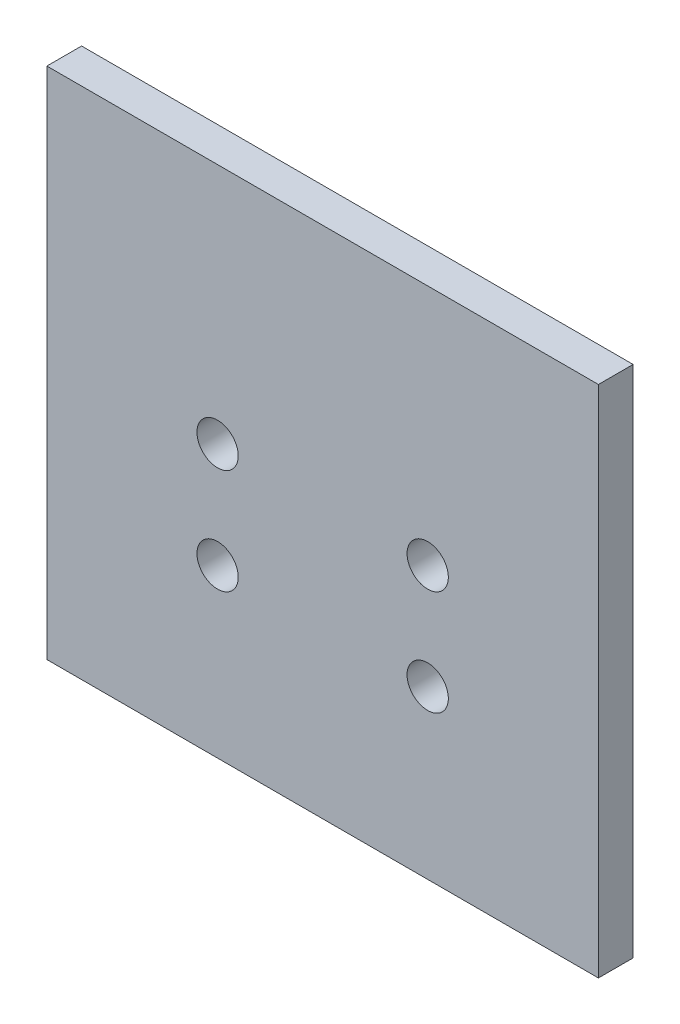
ISO-10303-21;
HEADER;
FILE_DESCRIPTION(('STEP AP214'),'2;1');
FILE_NAME('part.step','',(''),(''),'','','');
FILE_SCHEMA(('AUTOMOTIVE_DESIGN { 1 0 10303 214 1 1 1 1 }'));
ENDSEC;
DATA;
#1=APPLICATION_CONTEXT('core data for automotive mechanical design processes');
#2=APPLICATION_PROTOCOL_DEFINITION('international standard','automotive_design',2000,#1);
#3=PRODUCT_CONTEXT('',#1,'mechanical');
#4=PRODUCT('Part','Part','',(#3));
#5=PRODUCT_RELATED_PRODUCT_CATEGORY('part','',(#4));
#6=PRODUCT_DEFINITION_FORMATION('','',#4);
#7=PRODUCT_DEFINITION_CONTEXT('part definition',#1,'design');
#8=PRODUCT_DEFINITION('design','',#6,#7);
#9=PRODUCT_DEFINITION_SHAPE('','',#8);
#10=(LENGTH_UNIT() NAMED_UNIT(*) SI_UNIT(.MILLI.,.METRE.));
#11=(NAMED_UNIT(*) PLANE_ANGLE_UNIT() SI_UNIT($,.RADIAN.));
#12=(NAMED_UNIT(*) SI_UNIT($,.STERADIAN.) SOLID_ANGLE_UNIT());
#13=UNCERTAINTY_MEASURE_WITH_UNIT(LENGTH_MEASURE(1.E-05),#10,'distance_accuracy_value','');
#14=(GEOMETRIC_REPRESENTATION_CONTEXT(3) GLOBAL_UNCERTAINTY_ASSIGNED_CONTEXT((#13)) GLOBAL_UNIT_ASSIGNED_CONTEXT((#10,
#11,#12)) REPRESENTATION_CONTEXT('',''));
#15=CARTESIAN_POINT('',(0.,0.,0.));
#16=DIRECTION('',(0.,0.,1.));
#17=DIRECTION('',(1.,0.,0.));
#18=AXIS2_PLACEMENT_3D('',#15,#16,#17);
#19=CARTESIAN_POINT('',(73.5,68.5,0.));
#20=DIRECTION('',(0.,1.,0.));
#21=DIRECTION('',(0.,0.,1.));
#22=AXIS2_PLACEMENT_3D('',#19,#20,#21);
#23=PLANE('',#22);
#24=DIRECTION('',(-1.,0.,0.));
#25=VECTOR('',#24,1.);
#26=CARTESIAN_POINT('',(73.5,68.5,9.25));
#27=LINE('',#26,#25);
#28=CARTESIAN_POINT('',(73.5,68.5,9.25));
#29=VERTEX_POINT('',#28);
#30=CARTESIAN_POINT('',(-73.5,68.5,9.25));
#31=VERTEX_POINT('',#30);
#32=EDGE_CURVE('E104',#29,#31,#27,.T.);
#33=ORIENTED_EDGE('',*,*,#32,.F.);
#34=DIRECTION('',(0.,0.,1.));
#35=VECTOR('',#34,1.);
#36=CARTESIAN_POINT('',(73.5,68.5,0.));
#37=LINE('',#36,#35);
#38=CARTESIAN_POINT('',(73.5,68.5,0.));
#39=VERTEX_POINT('',#38);
#40=EDGE_CURVE('E11',#39,#29,#37,.T.);
#41=ORIENTED_EDGE('',*,*,#40,.F.);
#42=DIRECTION('',(-1.,0.,0.));
#43=VECTOR('',#42,1.);
#44=CARTESIAN_POINT('',(73.5,68.5,0.));
#45=LINE('',#44,#43);
#46=CARTESIAN_POINT('',(-73.5,68.5,0.));
#47=VERTEX_POINT('',#46);
#48=EDGE_CURVE('E97',#39,#47,#45,.T.);
#49=ORIENTED_EDGE('',*,*,#48,.T.);
#50=DIRECTION('',(0.,0.,1.));
#51=VECTOR('',#50,1.);
#52=CARTESIAN_POINT('',(-73.5,68.5,0.));
#53=LINE('',#52,#51);
#54=EDGE_CURVE('E42',#47,#31,#53,.T.);
#55=ORIENTED_EDGE('',*,*,#54,.T.);
#56=EDGE_LOOP('',(#33,#41,#49,#55));
#57=FACE_BOUND('',#56,.T.);
#58=ADVANCED_FACE('F39',(#57),#23,.T.);
#59=CARTESIAN_POINT('',(73.5,-68.5,0.));
#60=DIRECTION('',(1.,0.,0.));
#61=DIRECTION('',(0.,0.,-1.));
#62=AXIS2_PLACEMENT_3D('',#59,#60,#61);
#63=PLANE('',#62);
#64=DIRECTION('',(0.,1.,0.));
#65=VECTOR('',#64,1.);
#66=CARTESIAN_POINT('',(73.5,-68.5,9.25));
#67=LINE('',#66,#65);
#68=CARTESIAN_POINT('',(73.5,-68.5,9.25));
#69=VERTEX_POINT('',#68);
#70=EDGE_CURVE('E99',#69,#29,#67,.T.);
#71=ORIENTED_EDGE('',*,*,#70,.F.);
#72=DIRECTION('',(0.,0.,1.));
#73=VECTOR('',#72,1.);
#74=CARTESIAN_POINT('',(73.5,-68.5,0.));
#75=LINE('',#74,#73);
#76=CARTESIAN_POINT('',(73.5,-68.5,0.));
#77=VERTEX_POINT('',#76);
#78=EDGE_CURVE('E48',#77,#69,#75,.T.);
#79=ORIENTED_EDGE('',*,*,#78,.F.);
#80=DIRECTION('',(0.,1.,0.));
#81=VECTOR('',#80,1.);
#82=CARTESIAN_POINT('',(73.5,-68.5,0.));
#83=LINE('',#82,#81);
#84=EDGE_CURVE('E94',#77,#39,#83,.T.);
#85=ORIENTED_EDGE('',*,*,#84,.T.);
#86=ORIENTED_EDGE('',*,*,#40,.T.);
#87=EDGE_LOOP('',(#71,#79,#85,#86));
#88=FACE_BOUND('',#87,.T.);
#89=ADVANCED_FACE('F115',(#88),#63,.T.);
#90=CARTESIAN_POINT('',(-73.5,-68.5,0.));
#91=DIRECTION('',(0.,-1.,0.));
#92=DIRECTION('',(0.,0.,-1.));
#93=AXIS2_PLACEMENT_3D('',#90,#91,#92);
#94=PLANE('',#93);
#95=DIRECTION('',(1.,0.,0.));
#96=VECTOR('',#95,1.);
#97=CARTESIAN_POINT('',(-73.5,-68.5,9.25));
#98=LINE('',#97,#96);
#99=CARTESIAN_POINT('',(-73.5,-68.5,9.25));
#100=VERTEX_POINT('',#99);
#101=EDGE_CURVE('E89',#100,#69,#98,.T.);
#102=ORIENTED_EDGE('',*,*,#101,.F.);
#103=DIRECTION('',(0.,0.,1.));
#104=VECTOR('',#103,1.);
#105=CARTESIAN_POINT('',(-73.5,-68.5,0.));
#106=LINE('',#105,#104);
#107=CARTESIAN_POINT('',(-73.5,-68.5,0.));
#108=VERTEX_POINT('',#107);
#109=EDGE_CURVE('E84',#108,#100,#106,.T.);
#110=ORIENTED_EDGE('',*,*,#109,.F.);
#111=DIRECTION('',(1.,0.,0.));
#112=VECTOR('',#111,1.);
#113=CARTESIAN_POINT('',(-73.5,-68.5,0.));
#114=LINE('',#113,#112);
#115=EDGE_CURVE('E87',#108,#77,#114,.T.);
#116=ORIENTED_EDGE('',*,*,#115,.T.);
#117=ORIENTED_EDGE('',*,*,#78,.T.);
#118=EDGE_LOOP('',(#102,#110,#116,#117));
#119=FACE_BOUND('',#118,.T.);
#120=ADVANCED_FACE('F86',(#119),#94,.T.);
#121=CARTESIAN_POINT('',(-73.5,68.5,0.));
#122=DIRECTION('',(-1.,0.,0.));
#123=DIRECTION('',(0.,0.,1.));
#124=AXIS2_PLACEMENT_3D('',#121,#122,#123);
#125=PLANE('',#124);
#126=DIRECTION('',(0.,-1.,0.));
#127=VECTOR('',#126,1.);
#128=CARTESIAN_POINT('',(-73.5,68.5,9.25));
#129=LINE('',#128,#127);
#130=EDGE_CURVE('E107',#31,#100,#129,.T.);
#131=ORIENTED_EDGE('',*,*,#130,.F.);
#132=ORIENTED_EDGE('',*,*,#54,.F.);
#133=DIRECTION('',(0.,-1.,0.));
#134=VECTOR('',#133,1.);
#135=CARTESIAN_POINT('',(-73.5,68.5,0.));
#136=LINE('',#135,#134);
#137=EDGE_CURVE('E93',#47,#108,#136,.T.);
#138=ORIENTED_EDGE('',*,*,#137,.T.);
#139=ORIENTED_EDGE('',*,*,#109,.T.);
#140=EDGE_LOOP('',(#131,#132,#138,#139));
#141=FACE_BOUND('',#140,.T.);
#142=ADVANCED_FACE('F96',(#141),#125,.T.);
#143=CARTESIAN_POINT('',(0.,0.,0.));
#144=DIRECTION('',(0.,0.,1.));
#145=DIRECTION('',(1.,0.,0.));
#146=AXIS2_PLACEMENT_3D('',#143,#144,#145);
#147=PLANE('',#146);
#148=CARTESIAN_POINT('',(-28.,4.,0.));
#149=DIRECTION('',(0.,0.,1.));
#150=DIRECTION('',(-1.,0.,0.));
#151=AXIS2_PLACEMENT_3D('',#148,#149,#150);
#152=CIRCLE('',#151,5.5);
#153=CARTESIAN_POINT('',(-33.5,4.,0.));
#154=VERTEX_POINT('',#153);
#155=EDGE_CURVE('E156',#154,#154,#152,.T.);
#156=ORIENTED_EDGE('',*,*,#155,.T.);
#157=EDGE_LOOP('',(#156));
#158=FACE_BOUND('',#157,.T.);
#159=CARTESIAN_POINT('',(28.,4.,0.));
#160=DIRECTION('',(0.,0.,1.));
#161=DIRECTION('',(-1.,0.,0.));
#162=AXIS2_PLACEMENT_3D('',#159,#160,#161);
#163=CIRCLE('',#162,5.5);
#164=CARTESIAN_POINT('',(22.5,4.,0.));
#165=VERTEX_POINT('',#164);
#166=EDGE_CURVE('E164',#165,#165,#163,.T.);
#167=ORIENTED_EDGE('',*,*,#166,.T.);
#168=EDGE_LOOP('',(#167));
#169=FACE_BOUND('',#168,.T.);
#170=CARTESIAN_POINT('',(28.,-24.,0.));
#171=DIRECTION('',(0.,0.,1.));
#172=DIRECTION('',(-1.,0.,0.));
#173=AXIS2_PLACEMENT_3D('',#170,#171,#172);
#174=CIRCLE('',#173,5.5);
#175=CARTESIAN_POINT('',(22.5,-24.,0.));
#176=VERTEX_POINT('',#175);
#177=EDGE_CURVE('E170',#176,#176,#174,.T.);
#178=ORIENTED_EDGE('',*,*,#177,.T.);
#179=EDGE_LOOP('',(#178));
#180=FACE_BOUND('',#179,.T.);
#181=CARTESIAN_POINT('',(-28.,-24.,0.));
#182=DIRECTION('',(0.,0.,1.));
#183=DIRECTION('',(-1.,0.,0.));
#184=AXIS2_PLACEMENT_3D('',#181,#182,#183);
#185=CIRCLE('',#184,5.5);
#186=CARTESIAN_POINT('',(-33.5,-24.,0.));
#187=VERTEX_POINT('',#186);
#188=EDGE_CURVE('E108',#187,#187,#185,.T.);
#189=ORIENTED_EDGE('',*,*,#188,.T.);
#190=EDGE_LOOP('',(#189));
#191=FACE_BOUND('',#190,.T.);
#192=ORIENTED_EDGE('',*,*,#48,.F.);
#193=ORIENTED_EDGE('',*,*,#84,.F.);
#194=ORIENTED_EDGE('',*,*,#115,.F.);
#195=ORIENTED_EDGE('',*,*,#137,.F.);
#196=EDGE_LOOP('',(#192,#193,#194,#195));
#197=FACE_BOUND('',#196,.T.);
#198=ADVANCED_FACE('F92',(#158,#169,#180,#191,#197),#147,.F.);
#199=CARTESIAN_POINT('',(0.,0.,9.25));
#200=DIRECTION('',(0.,0.,1.));
#201=DIRECTION('',(1.,0.,0.));
#202=AXIS2_PLACEMENT_3D('',#199,#200,#201);
#203=PLANE('',#202);
#204=CARTESIAN_POINT('',(-28.,4.,9.25));
#205=DIRECTION('',(0.,0.,1.));
#206=DIRECTION('',(-1.,0.,0.));
#207=AXIS2_PLACEMENT_3D('',#204,#205,#206);
#208=CIRCLE('',#207,5.5);
#209=CARTESIAN_POINT('',(-33.5,4.,9.25));
#210=VERTEX_POINT('',#209);
#211=EDGE_CURVE('E159',#210,#210,#208,.T.);
#212=ORIENTED_EDGE('',*,*,#211,.F.);
#213=EDGE_LOOP('',(#212));
#214=FACE_BOUND('',#213,.T.);
#215=CARTESIAN_POINT('',(28.,4.,9.25));
#216=DIRECTION('',(0.,0.,1.));
#217=DIRECTION('',(-1.,0.,0.));
#218=AXIS2_PLACEMENT_3D('',#215,#216,#217);
#219=CIRCLE('',#218,5.5);
#220=CARTESIAN_POINT('',(22.5,4.,9.25));
#221=VERTEX_POINT('',#220);
#222=EDGE_CURVE('E161',#221,#221,#219,.T.);
#223=ORIENTED_EDGE('',*,*,#222,.F.);
#224=EDGE_LOOP('',(#223));
#225=FACE_BOUND('',#224,.T.);
#226=CARTESIAN_POINT('',(28.,-24.,9.25));
#227=DIRECTION('',(0.,0.,1.));
#228=DIRECTION('',(-1.,0.,0.));
#229=AXIS2_PLACEMENT_3D('',#226,#227,#228);
#230=CIRCLE('',#229,5.5);
#231=CARTESIAN_POINT('',(22.5,-24.,9.25));
#232=VERTEX_POINT('',#231);
#233=EDGE_CURVE('E167',#232,#232,#230,.T.);
#234=ORIENTED_EDGE('',*,*,#233,.F.);
#235=EDGE_LOOP('',(#234));
#236=FACE_BOUND('',#235,.T.);
#237=CARTESIAN_POINT('',(-28.,-24.,9.25));
#238=DIRECTION('',(0.,0.,1.));
#239=DIRECTION('',(-1.,0.,0.));
#240=AXIS2_PLACEMENT_3D('',#237,#238,#239);
#241=CIRCLE('',#240,5.5);
#242=CARTESIAN_POINT('',(-33.5,-24.,9.25));
#243=VERTEX_POINT('',#242);
#244=EDGE_CURVE('E173',#243,#243,#241,.T.);
#245=ORIENTED_EDGE('',*,*,#244,.F.);
#246=EDGE_LOOP('',(#245));
#247=FACE_BOUND('',#246,.T.);
#248=ORIENTED_EDGE('',*,*,#32,.T.);
#249=ORIENTED_EDGE('',*,*,#130,.T.);
#250=ORIENTED_EDGE('',*,*,#101,.T.);
#251=ORIENTED_EDGE('',*,*,#70,.T.);
#252=EDGE_LOOP('',(#248,#249,#250,#251));
#253=FACE_BOUND('',#252,.T.);
#254=ADVANCED_FACE('F114',(#214,#225,#236,#247,#253),#203,.T.);
#255=CARTESIAN_POINT('',(-28.,-24.,0.));
#256=DIRECTION('',(0.,0.,1.));
#257=DIRECTION('',(1.,0.,0.));
#258=AXIS2_PLACEMENT_3D('',#255,#256,#257);
#259=CYLINDRICAL_SURFACE('',#258,5.5);
#260=ORIENTED_EDGE('',*,*,#188,.F.);
#261=EDGE_LOOP('',(#260));
#262=FACE_BOUND('',#261,.T.);
#263=ORIENTED_EDGE('',*,*,#244,.T.);
#264=EDGE_LOOP('',(#263));
#265=FACE_BOUND('',#264,.T.);
#266=ADVANCED_FACE('F133',(#262,#265),#259,.F.);
#267=CARTESIAN_POINT('',(28.,-24.,0.));
#268=DIRECTION('',(0.,0.,1.));
#269=DIRECTION('',(1.,0.,0.));
#270=AXIS2_PLACEMENT_3D('',#267,#268,#269);
#271=CYLINDRICAL_SURFACE('',#270,5.5);
#272=ORIENTED_EDGE('',*,*,#177,.F.);
#273=EDGE_LOOP('',(#272));
#274=FACE_BOUND('',#273,.T.);
#275=ORIENTED_EDGE('',*,*,#233,.T.);
#276=EDGE_LOOP('',(#275));
#277=FACE_BOUND('',#276,.T.);
#278=ADVANCED_FACE('F140',(#274,#277),#271,.F.);
#279=CARTESIAN_POINT('',(28.,4.,0.));
#280=DIRECTION('',(0.,0.,1.));
#281=DIRECTION('',(1.,0.,0.));
#282=AXIS2_PLACEMENT_3D('',#279,#280,#281);
#283=CYLINDRICAL_SURFACE('',#282,5.5);
#284=ORIENTED_EDGE('',*,*,#166,.F.);
#285=EDGE_LOOP('',(#284));
#286=FACE_BOUND('',#285,.T.);
#287=ORIENTED_EDGE('',*,*,#222,.T.);
#288=EDGE_LOOP('',(#287));
#289=FACE_BOUND('',#288,.T.);
#290=ADVANCED_FACE('F144',(#286,#289),#283,.F.);
#291=CARTESIAN_POINT('',(-28.,4.,0.));
#292=DIRECTION('',(0.,0.,1.));
#293=DIRECTION('',(1.,0.,0.));
#294=AXIS2_PLACEMENT_3D('',#291,#292,#293);
#295=CYLINDRICAL_SURFACE('',#294,5.5);
#296=ORIENTED_EDGE('',*,*,#155,.F.);
#297=EDGE_LOOP('',(#296));
#298=FACE_BOUND('',#297,.T.);
#299=ORIENTED_EDGE('',*,*,#211,.T.);
#300=EDGE_LOOP('',(#299));
#301=FACE_BOUND('',#300,.T.);
#302=ADVANCED_FACE('F148',(#298,#301),#295,.F.);
#303=CLOSED_SHELL('',(#58,#89,#120,#142,#198,#254,#266,#278,#290,#302));
#304=MANIFOLD_SOLID_BREP('B2',#303);
#305=ADVANCED_BREP_SHAPE_REPRESENTATION('',(#18,#304),#14);
#306=SHAPE_DEFINITION_REPRESENTATION(#9,#305);
ENDSEC;
END-ISO-10303-21;
